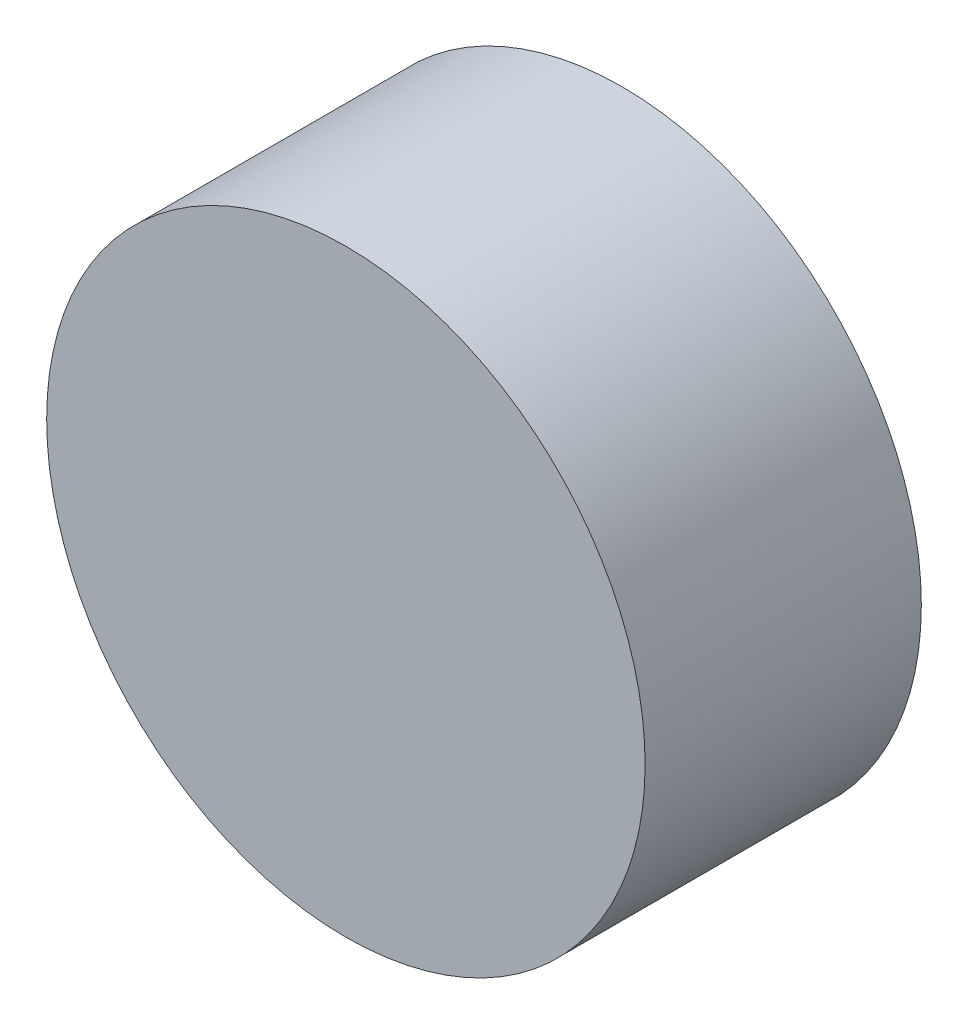
ISO-10303-21;
HEADER;
FILE_DESCRIPTION(('STEP AP214'),'2;1');
FILE_NAME('part.step','',(''),(''),'','','');
FILE_SCHEMA(('AUTOMOTIVE_DESIGN { 1 0 10303 214 1 1 1 1 }'));
ENDSEC;
DATA;
#1=APPLICATION_CONTEXT('core data for automotive mechanical design processes');
#2=APPLICATION_PROTOCOL_DEFINITION('international standard','automotive_design',2000,#1);
#3=PRODUCT_CONTEXT('',#1,'mechanical');
#4=PRODUCT('Part','Part','',(#3));
#5=PRODUCT_RELATED_PRODUCT_CATEGORY('part','',(#4));
#6=PRODUCT_DEFINITION_FORMATION('','',#4);
#7=PRODUCT_DEFINITION_CONTEXT('part definition',#1,'design');
#8=PRODUCT_DEFINITION('design','',#6,#7);
#9=PRODUCT_DEFINITION_SHAPE('','',#8);
#10=(LENGTH_UNIT() NAMED_UNIT(*) SI_UNIT(.MILLI.,.METRE.));
#11=(NAMED_UNIT(*) PLANE_ANGLE_UNIT() SI_UNIT($,.RADIAN.));
#12=(NAMED_UNIT(*) SI_UNIT($,.STERADIAN.) SOLID_ANGLE_UNIT());
#13=UNCERTAINTY_MEASURE_WITH_UNIT(LENGTH_MEASURE(1.E-05),#10,'distance_accuracy_value','');
#14=(GEOMETRIC_REPRESENTATION_CONTEXT(3) GLOBAL_UNCERTAINTY_ASSIGNED_CONTEXT((#13)) GLOBAL_UNIT_ASSIGNED_CONTEXT((#10,
#11,#12)) REPRESENTATION_CONTEXT('',''));
#15=CARTESIAN_POINT('',(0.,0.,0.));
#16=DIRECTION('',(0.,0.,1.));
#17=DIRECTION('',(1.,0.,0.));
#18=AXIS2_PLACEMENT_3D('',#15,#16,#17);
#19=CARTESIAN_POINT('',(0.,0.,60.));
#20=DIRECTION('',(0.,0.,-1.));
#21=DIRECTION('',(-1.,0.,0.));
#22=AXIS2_PLACEMENT_3D('',#19,#20,#21);
#23=CYLINDRICAL_SURFACE('',#22,65.);
#24=CARTESIAN_POINT('',(0.,0.,60.));
#25=DIRECTION('',(0.,0.,1.));
#26=DIRECTION('',(1.,0.,0.));
#27=AXIS2_PLACEMENT_3D('',#24,#25,#26);
#28=CIRCLE('',#27,65.);
#29=CARTESIAN_POINT('',(65.,0.,60.));
#30=VERTEX_POINT('',#29);
#31=EDGE_CURVE('E10',#30,#30,#28,.T.);
#32=ORIENTED_EDGE('',*,*,#31,.F.);
#33=EDGE_LOOP('',(#32));
#34=FACE_BOUND('',#33,.T.);
#35=CARTESIAN_POINT('',(0.,0.,0.));
#36=DIRECTION('',(0.,0.,1.));
#37=DIRECTION('',(1.,0.,0.));
#38=AXIS2_PLACEMENT_3D('',#35,#36,#37);
#39=CIRCLE('',#38,65.);
#40=CARTESIAN_POINT('',(65.,0.,0.));
#41=VERTEX_POINT('',#40);
#42=EDGE_CURVE('E37',#41,#41,#39,.T.);
#43=ORIENTED_EDGE('',*,*,#42,.T.);
#44=EDGE_LOOP('',(#43));
#45=FACE_BOUND('',#44,.T.);
#46=ADVANCED_FACE('F34',(#34,#45),#23,.T.);
#47=CARTESIAN_POINT('',(0.,0.,60.));
#48=DIRECTION('',(0.,0.,1.));
#49=DIRECTION('',(1.,0.,0.));
#50=AXIS2_PLACEMENT_3D('',#47,#48,#49);
#51=PLANE('',#50);
#52=ORIENTED_EDGE('',*,*,#31,.T.);
#53=EDGE_LOOP('',(#52));
#54=FACE_BOUND('',#53,.T.);
#55=ADVANCED_FACE('F49',(#54),#51,.T.);
#56=CARTESIAN_POINT('',(0.,0.,0.));
#57=DIRECTION('',(0.,0.,1.));
#58=DIRECTION('',(1.,0.,0.));
#59=AXIS2_PLACEMENT_3D('',#56,#57,#58);
#60=PLANE('',#59);
#61=ORIENTED_EDGE('',*,*,#42,.F.);
#62=EDGE_LOOP('',(#61));
#63=FACE_BOUND('',#62,.T.);
#64=ADVANCED_FACE('F47',(#63),#60,.F.);
#65=CLOSED_SHELL('',(#46,#55,#64));
#66=MANIFOLD_SOLID_BREP('B2',#65);
#67=ADVANCED_BREP_SHAPE_REPRESENTATION('',(#18,#66),#14);
#68=SHAPE_DEFINITION_REPRESENTATION(#9,#67);
ENDSEC;
END-ISO-10303-21;
